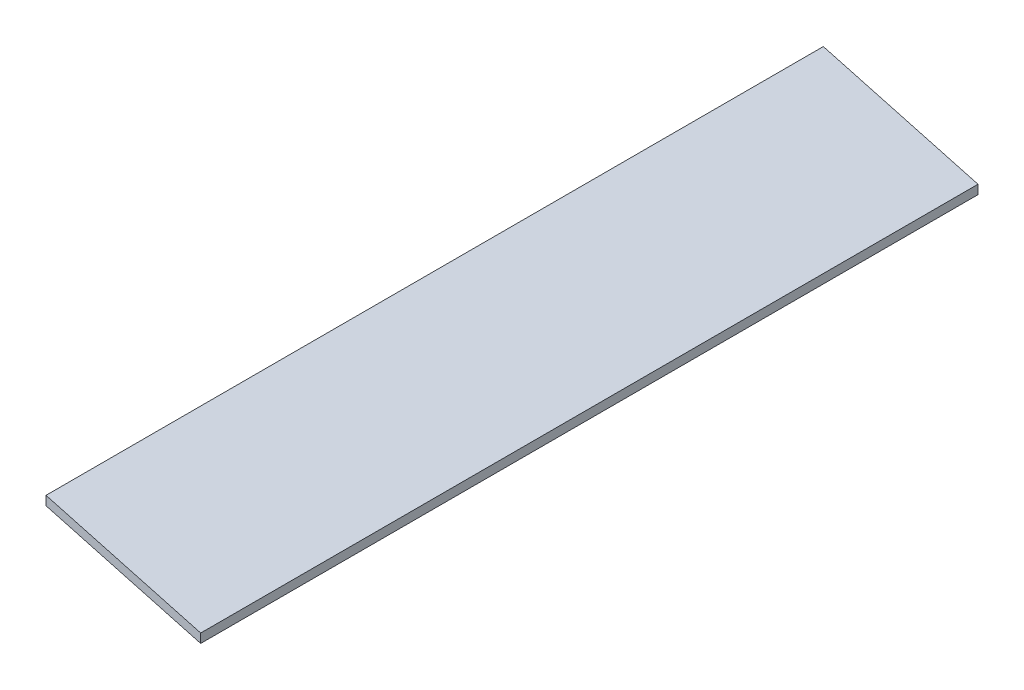
ISO-10303-21;
HEADER;
FILE_DESCRIPTION(('STEP AP214'),'2;1');
FILE_NAME('part.step','',(''),(''),'','','');
FILE_SCHEMA(('AUTOMOTIVE_DESIGN { 1 0 10303 214 1 1 1 1 }'));
ENDSEC;
DATA;
#1=APPLICATION_CONTEXT('core data for automotive mechanical design processes');
#2=APPLICATION_PROTOCOL_DEFINITION('international standard','automotive_design',2000,#1);
#3=PRODUCT_CONTEXT('',#1,'mechanical');
#4=PRODUCT('Part','Part','',(#3));
#5=PRODUCT_RELATED_PRODUCT_CATEGORY('part','',(#4));
#6=PRODUCT_DEFINITION_FORMATION('','',#4);
#7=PRODUCT_DEFINITION_CONTEXT('part definition',#1,'design');
#8=PRODUCT_DEFINITION('design','',#6,#7);
#9=PRODUCT_DEFINITION_SHAPE('','',#8);
#10=(LENGTH_UNIT() NAMED_UNIT(*) SI_UNIT(.MILLI.,.METRE.));
#11=(NAMED_UNIT(*) PLANE_ANGLE_UNIT() SI_UNIT($,.RADIAN.));
#12=(NAMED_UNIT(*) SI_UNIT($,.STERADIAN.) SOLID_ANGLE_UNIT());
#13=UNCERTAINTY_MEASURE_WITH_UNIT(LENGTH_MEASURE(1.E-05),#10,'distance_accuracy_value','');
#14=(GEOMETRIC_REPRESENTATION_CONTEXT(3) GLOBAL_UNCERTAINTY_ASSIGNED_CONTEXT((#13)) GLOBAL_UNIT_ASSIGNED_CONTEXT((#10,
#11,#12)) REPRESENTATION_CONTEXT('',''));
#15=CARTESIAN_POINT('',(0.,0.,0.));
#16=DIRECTION('',(0.,0.,1.));
#17=DIRECTION('',(1.,0.,0.));
#18=AXIS2_PLACEMENT_3D('',#15,#16,#17);
#19=CARTESIAN_POINT('',(-8.631267976045,2.15,0.));
#20=DIRECTION('',(0.,1.,0.));
#21=DIRECTION('',(0.,0.,1.));
#22=AXIS2_PLACEMENT_3D('',#19,#20,#21);
#23=PLANE('',#22);
#24=DIRECTION('',(-0.978028665454272,0.,-0.208470452462058));
#25=VECTOR('',#24,1.);
#26=CARTESIAN_POINT('',(-7.729586682395,2.15,-4.230192537499));
#27=LINE('',#26,#25);
#28=CARTESIAN_POINT('',(2.24865411186904,2.15,-2.10329335076616));
#29=VERTEX_POINT('',#28);
#30=CARTESIAN_POINT('',(2.03126844334107,2.15,-2.14962991561033));
#31=VERTEX_POINT('',#30);
#32=EDGE_CURVE('E79',#29,#31,#27,.T.);
#33=ORIENTED_EDGE('',*,*,#32,.F.);
#34=DIRECTION('',(0.,0.,-1.));
#35=VECTOR('',#34,1.);
#36=CARTESIAN_POINT('',(2.248654111869,2.15,0.));
#37=LINE('',#36,#35);
#38=CARTESIAN_POINT('',(2.24865411186908,2.15,-1.24374146015436));
#39=VERTEX_POINT('',#38);
#40=EDGE_CURVE('E55',#39,#29,#37,.T.);
#41=ORIENTED_EDGE('',*,*,#40,.F.);
#42=DIRECTION('',(0.978028665454272,0.,0.208470452462058));
#43=VECTOR('',#42,1.);
#44=CARTESIAN_POINT('',(-7.904840784767,2.15,-3.407996711498));
#45=LINE('',#44,#43);
#46=CARTESIAN_POINT('',(2.03126844334106,2.15,-1.29007802499929));
#47=VERTEX_POINT('',#46);
#48=EDGE_CURVE('E57',#47,#39,#45,.T.);
#49=ORIENTED_EDGE('',*,*,#48,.F.);
#50=DIRECTION('',(0.,0.,1.));
#51=VECTOR('',#50,1.);
#52=CARTESIAN_POINT('',(2.031268443341,2.15,0.));
#53=LINE('',#52,#51);
#54=EDGE_CURVE('E20',#31,#47,#53,.T.);
#55=ORIENTED_EDGE('',*,*,#54,.F.);
#56=EDGE_LOOP('',(#33,#41,#49,#55));
#57=FACE_BOUND('',#56,.T.);
#58=ADVANCED_FACE('F17',(#57),#23,.F.);
#59=CARTESIAN_POINT('',(2.031268443341,2.16,0.));
#60=DIRECTION('',(-1.,0.,0.));
#61=DIRECTION('',(0.,0.,1.));
#62=AXIS2_PLACEMENT_3D('',#59,#60,#61);
#63=PLANE('',#62);
#64=DIRECTION('',(0.,0.,1.));
#65=VECTOR('',#64,1.);
#66=CARTESIAN_POINT('',(2.031268443341,2.16,0.));
#67=LINE('',#66,#65);
#68=CARTESIAN_POINT('',(2.03126844334107,2.16,-2.14962991561033));
#69=VERTEX_POINT('',#68);
#70=CARTESIAN_POINT('',(2.03126844334106,2.16,-1.29007802499929));
#71=VERTEX_POINT('',#70);
#72=EDGE_CURVE('E83',#69,#71,#67,.T.);
#73=ORIENTED_EDGE('',*,*,#72,.F.);
#74=DIRECTION('',(0.,1.,0.));
#75=VECTOR('',#74,1.);
#76=CARTESIAN_POINT('',(2.03126844334129,2.16,-2.14962991561133));
#77=LINE('',#76,#75);
#78=EDGE_CURVE('E68',#31,#69,#77,.T.);
#79=ORIENTED_EDGE('',*,*,#78,.F.);
#80=ORIENTED_EDGE('',*,*,#54,.T.);
#81=DIRECTION('',(0.,1.,0.));
#82=VECTOR('',#81,1.);
#83=CARTESIAN_POINT('',(2.03126844334125,2.16,-1.29007802500015));
#84=LINE('',#83,#82);
#85=EDGE_CURVE('E63',#71,#47,#84,.F.);
#86=ORIENTED_EDGE('',*,*,#85,.F.);
#87=EDGE_LOOP('',(#73,#79,#80,#86));
#88=FACE_BOUND('',#87,.T.);
#89=ADVANCED_FACE('F65',(#88),#63,.T.);
#90=CARTESIAN_POINT('',(-7.904840784767,2.16,-3.407996711498));
#91=DIRECTION('',(-0.208470452462058,0.,0.978028665454272));
#92=DIRECTION('',(0.978028665454272,0.,0.208470452462058));
#93=AXIS2_PLACEMENT_3D('',#90,#91,#92);
#94=PLANE('',#93);
#95=DIRECTION('',(0.978028665453998,0.,0.208470452463342));
#96=VECTOR('',#95,1.);
#97=CARTESIAN_POINT('',(2.031268443341,2.16,-1.290078024999));
#98=LINE('',#97,#96);
#99=CARTESIAN_POINT('',(2.24865411186915,2.16,-1.24374146015472));
#100=VERTEX_POINT('',#99);
#101=EDGE_CURVE('E72',#71,#100,#98,.T.);
#102=ORIENTED_EDGE('',*,*,#101,.F.);
#103=ORIENTED_EDGE('',*,*,#85,.T.);
#104=ORIENTED_EDGE('',*,*,#48,.T.);
#105=DIRECTION('',(0.,1.,0.));
#106=VECTOR('',#105,1.);
#107=CARTESIAN_POINT('',(2.248654111869,2.16,-1.243741460154));
#108=LINE('',#107,#106);
#109=EDGE_CURVE('E75',#100,#39,#108,.F.);
#110=ORIENTED_EDGE('',*,*,#109,.F.);
#111=EDGE_LOOP('',(#102,#103,#104,#110));
#112=FACE_BOUND('',#111,.T.);
#113=ADVANCED_FACE('F70',(#112),#94,.T.);
#114=CARTESIAN_POINT('',(2.248654111869,2.16,0.));
#115=DIRECTION('',(1.,0.,0.));
#116=DIRECTION('',(0.,0.,-1.));
#117=AXIS2_PLACEMENT_3D('',#114,#115,#116);
#118=PLANE('',#117);
#119=DIRECTION('',(0.,0.,1.));
#120=VECTOR('',#119,1.);
#121=CARTESIAN_POINT('',(2.248654111869,2.16,0.));
#122=LINE('',#121,#120);
#123=CARTESIAN_POINT('',(2.24865411186904,2.16,-2.10329335076616));
#124=VERTEX_POINT('',#123);
#125=EDGE_CURVE('E26',#100,#124,#122,.F.);
#126=ORIENTED_EDGE('',*,*,#125,.F.);
#127=ORIENTED_EDGE('',*,*,#109,.T.);
#128=ORIENTED_EDGE('',*,*,#40,.T.);
#129=DIRECTION('',(0.,1.,0.));
#130=VECTOR('',#129,1.);
#131=CARTESIAN_POINT('',(2.24865411186914,2.16,-2.10329335076666));
#132=LINE('',#131,#130);
#133=EDGE_CURVE('E35',#124,#29,#132,.F.);
#134=ORIENTED_EDGE('',*,*,#133,.F.);
#135=EDGE_LOOP('',(#126,#127,#128,#134));
#136=FACE_BOUND('',#135,.T.);
#137=ADVANCED_FACE('F89',(#136),#118,.T.);
#138=CARTESIAN_POINT('',(-7.729586682395,2.16,-4.230192537499));
#139=DIRECTION('',(0.208470452462058,0.,-0.978028665454272));
#140=DIRECTION('',(-0.978028665454272,0.,-0.208470452462058));
#141=AXIS2_PLACEMENT_3D('',#138,#139,#140);
#142=PLANE('',#141);
#143=DIRECTION('',(-0.978028665454916,0.,-0.208470452459038));
#144=VECTOR('',#143,1.);
#145=CARTESIAN_POINT('',(2.248654111869,2.16,-2.103293350766));
#146=LINE('',#145,#144);
#147=EDGE_CURVE('E11',#124,#69,#146,.T.);
#148=ORIENTED_EDGE('',*,*,#147,.F.);
#149=ORIENTED_EDGE('',*,*,#133,.T.);
#150=ORIENTED_EDGE('',*,*,#32,.T.);
#151=ORIENTED_EDGE('',*,*,#78,.T.);
#152=EDGE_LOOP('',(#148,#149,#150,#151));
#153=FACE_BOUND('',#152,.T.);
#154=ADVANCED_FACE('F91',(#153),#142,.T.);
#155=CARTESIAN_POINT('',(-8.631267976045,2.16,0.));
#156=DIRECTION('',(0.,1.,0.));
#157=DIRECTION('',(0.,0.,1.));
#158=AXIS2_PLACEMENT_3D('',#155,#156,#157);
#159=PLANE('',#158);
#160=ORIENTED_EDGE('',*,*,#125,.T.);
#161=ORIENTED_EDGE('',*,*,#147,.T.);
#162=ORIENTED_EDGE('',*,*,#72,.T.);
#163=ORIENTED_EDGE('',*,*,#101,.T.);
#164=EDGE_LOOP('',(#160,#161,#162,#163));
#165=FACE_BOUND('',#164,.T.);
#166=ADVANCED_FACE('F88',(#165),#159,.T.);
#167=CLOSED_SHELL('',(#58,#89,#113,#137,#154,#166));
#168=MANIFOLD_SOLID_BREP('B1',#167);
#169=ADVANCED_BREP_SHAPE_REPRESENTATION('',(#18,#168),#14);
#170=SHAPE_DEFINITION_REPRESENTATION(#9,#169);
ENDSEC;
END-ISO-10303-21;
